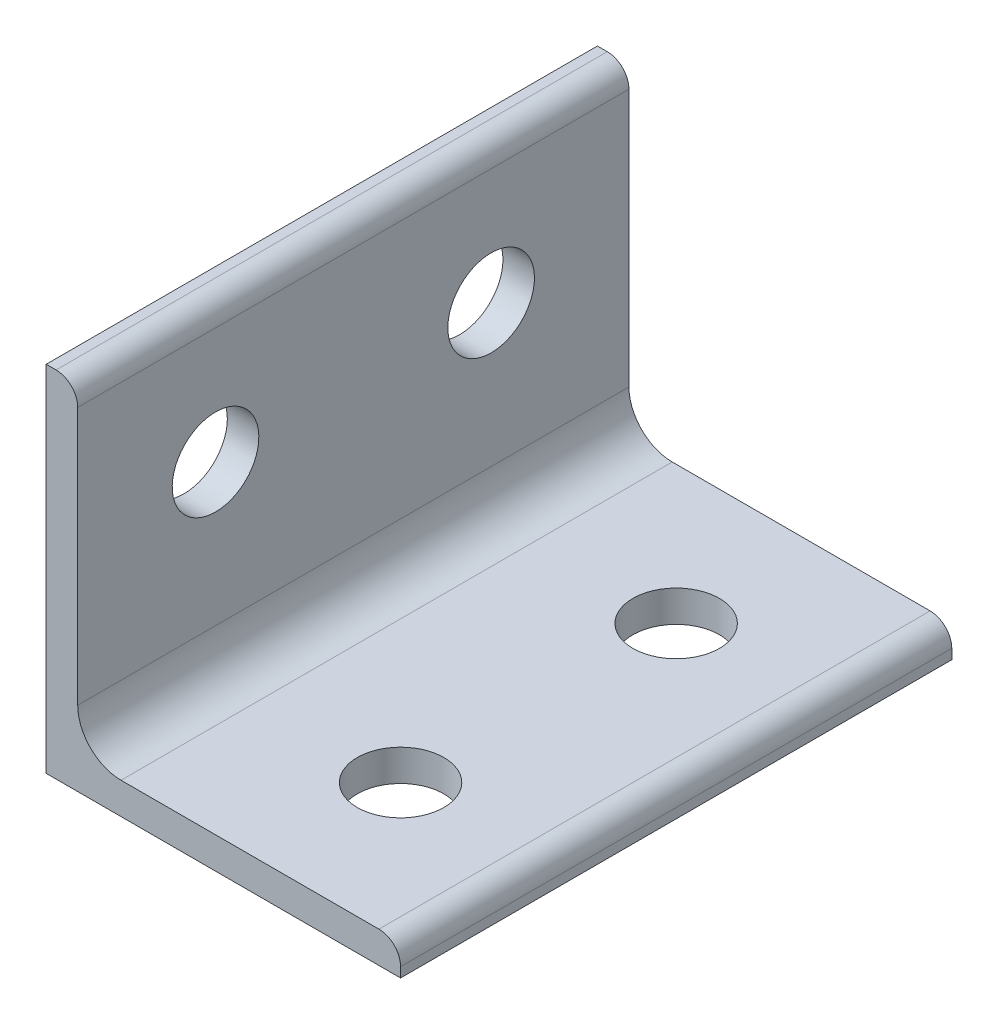
ISO-10303-21;
HEADER;
FILE_DESCRIPTION(('STEP AP214'),'2;1');
FILE_NAME('part.step','',(''),(''),'','','');
FILE_SCHEMA(('AUTOMOTIVE_DESIGN { 1 0 10303 214 1 1 1 1 }'));
ENDSEC;
DATA;
#1=APPLICATION_CONTEXT('core data for automotive mechanical design processes');
#2=APPLICATION_PROTOCOL_DEFINITION('international standard','automotive_design',2000,#1);
#3=PRODUCT_CONTEXT('',#1,'mechanical');
#4=PRODUCT('Part','Part','',(#3));
#5=PRODUCT_RELATED_PRODUCT_CATEGORY('part','',(#4));
#6=PRODUCT_DEFINITION_FORMATION('','',#4);
#7=PRODUCT_DEFINITION_CONTEXT('part definition',#1,'design');
#8=PRODUCT_DEFINITION('design','',#6,#7);
#9=PRODUCT_DEFINITION_SHAPE('','',#8);
#10=(LENGTH_UNIT() NAMED_UNIT(*) SI_UNIT(.MILLI.,.METRE.));
#11=(NAMED_UNIT(*) PLANE_ANGLE_UNIT() SI_UNIT($,.RADIAN.));
#12=(NAMED_UNIT(*) SI_UNIT($,.STERADIAN.) SOLID_ANGLE_UNIT());
#13=UNCERTAINTY_MEASURE_WITH_UNIT(LENGTH_MEASURE(1.E-05),#10,'distance_accuracy_value','');
#14=(GEOMETRIC_REPRESENTATION_CONTEXT(3) GLOBAL_UNCERTAINTY_ASSIGNED_CONTEXT((#13)) GLOBAL_UNIT_ASSIGNED_CONTEXT((#10,
#11,#12)) REPRESENTATION_CONTEXT('',''));
#15=CARTESIAN_POINT('',(0.,0.,0.));
#16=DIRECTION('',(0.,0.,1.));
#17=DIRECTION('',(1.,0.,0.));
#18=AXIS2_PLACEMENT_3D('',#15,#16,#17);
#19=CARTESIAN_POINT('',(0.,0.,70.));
#20=DIRECTION('',(0.,1.,0.));
#21=DIRECTION('',(0.,0.,1.));
#22=AXIS2_PLACEMENT_3D('',#19,#20,#21);
#23=PLANE('',#22);
#24=CARTESIAN_POINT('',(55.,0.,-35.));
#25=DIRECTION('',(0.,1.,0.));
#26=DIRECTION('',(0.,0.,1.));
#27=AXIS2_PLACEMENT_3D('',#24,#25,#26);
#28=CIRCLE('',#27,11.);
#29=CARTESIAN_POINT('',(55.,0.,-24.));
#30=VERTEX_POINT('',#29);
#31=EDGE_CURVE('E182',#30,#30,#28,.T.);
#32=ORIENTED_EDGE('',*,*,#31,.T.);
#33=EDGE_LOOP('',(#32));
#34=FACE_BOUND('',#33,.T.);
#35=CARTESIAN_POINT('',(55.,0.,35.));
#36=DIRECTION('',(0.,1.,0.));
#37=DIRECTION('',(0.,0.,1.));
#38=AXIS2_PLACEMENT_3D('',#35,#36,#37);
#39=CIRCLE('',#38,11.);
#40=CARTESIAN_POINT('',(55.,0.,46.));
#41=VERTEX_POINT('',#40);
#42=EDGE_CURVE('E148',#41,#41,#39,.T.);
#43=ORIENTED_EDGE('',*,*,#42,.T.);
#44=EDGE_LOOP('',(#43));
#45=FACE_BOUND('',#44,.T.);
#46=DIRECTION('',(1.,0.,0.));
#47=VECTOR('',#46,1.);
#48=CARTESIAN_POINT('',(0.,0.,-70.));
#49=LINE('',#48,#47);
#50=CARTESIAN_POINT('',(0.,0.,-70.));
#51=VERTEX_POINT('',#50);
#52=CARTESIAN_POINT('',(90.,0.,-70.));
#53=VERTEX_POINT('',#52);
#54=EDGE_CURVE('E144',#51,#53,#49,.T.);
#55=ORIENTED_EDGE('',*,*,#54,.T.);
#56=DIRECTION('',(0.,0.,-1.));
#57=VECTOR('',#56,1.);
#58=CARTESIAN_POINT('',(90.,0.,70.));
#59=LINE('',#58,#57);
#60=CARTESIAN_POINT('',(90.,0.,70.));
#61=VERTEX_POINT('',#60);
#62=EDGE_CURVE('E11',#61,#53,#59,.T.);
#63=ORIENTED_EDGE('',*,*,#62,.F.);
#64=DIRECTION('',(1.,0.,0.));
#65=VECTOR('',#64,1.);
#66=CARTESIAN_POINT('',(0.,0.,70.));
#67=LINE('',#66,#65);
#68=CARTESIAN_POINT('',(0.,0.,70.));
#69=VERTEX_POINT('',#68);
#70=EDGE_CURVE('E161',#69,#61,#67,.T.);
#71=ORIENTED_EDGE('',*,*,#70,.F.);
#72=DIRECTION('',(0.,0.,-1.));
#73=VECTOR('',#72,1.);
#74=CARTESIAN_POINT('',(0.,0.,70.));
#75=LINE('',#74,#73);
#76=EDGE_CURVE('E140',#69,#51,#75,.T.);
#77=ORIENTED_EDGE('',*,*,#76,.T.);
#78=EDGE_LOOP('',(#55,#63,#71,#77));
#79=FACE_BOUND('',#78,.T.);
#80=ADVANCED_FACE('F40',(#34,#45,#79),#23,.F.);
#81=CARTESIAN_POINT('',(90.,0.,70.));
#82=DIRECTION('',(-1.,0.,0.));
#83=DIRECTION('',(0.,0.,1.));
#84=AXIS2_PLACEMENT_3D('',#81,#82,#83);
#85=PLANE('',#84);
#86=DIRECTION('',(0.,1.,0.));
#87=VECTOR('',#86,1.);
#88=CARTESIAN_POINT('',(90.,0.,-70.));
#89=LINE('',#88,#87);
#90=CARTESIAN_POINT('',(90.,2.5,-70.));
#91=VERTEX_POINT('',#90);
#92=EDGE_CURVE('E147',#53,#91,#89,.T.);
#93=ORIENTED_EDGE('',*,*,#92,.T.);
#94=DIRECTION('',(0.,0.,-1.));
#95=VECTOR('',#94,1.);
#96=CARTESIAN_POINT('',(90.,2.5,70.));
#97=LINE('',#96,#95);
#98=CARTESIAN_POINT('',(90.,2.5,70.));
#99=VERTEX_POINT('',#98);
#100=EDGE_CURVE('E49',#99,#91,#97,.T.);
#101=ORIENTED_EDGE('',*,*,#100,.F.);
#102=DIRECTION('',(0.,1.,0.));
#103=VECTOR('',#102,1.);
#104=CARTESIAN_POINT('',(90.,0.,70.));
#105=LINE('',#104,#103);
#106=EDGE_CURVE('E104',#61,#99,#105,.T.);
#107=ORIENTED_EDGE('',*,*,#106,.F.);
#108=ORIENTED_EDGE('',*,*,#62,.T.);
#109=EDGE_LOOP('',(#93,#101,#107,#108));
#110=FACE_BOUND('',#109,.T.);
#111=ADVANCED_FACE('F238',(#110),#85,.F.);
#112=CARTESIAN_POINT('',(84.5,2.5,70.));
#113=DIRECTION('',(0.,0.,-1.));
#114=DIRECTION('',(-1.,0.,0.));
#115=AXIS2_PLACEMENT_3D('',#112,#113,#114);
#116=CYLINDRICAL_SURFACE('',#115,5.50000000000001);
#117=CARTESIAN_POINT('',(84.5,2.5,-70.));
#118=DIRECTION('',(0.,0.,1.));
#119=DIRECTION('',(1.,0.,0.));
#120=AXIS2_PLACEMENT_3D('',#117,#118,#119);
#121=CIRCLE('',#120,5.50000000000001);
#122=CARTESIAN_POINT('',(84.5,8.,-70.));
#123=VERTEX_POINT('',#122);
#124=EDGE_CURVE('E150',#91,#123,#121,.T.);
#125=ORIENTED_EDGE('',*,*,#124,.T.);
#126=DIRECTION('',(0.,0.,-1.));
#127=VECTOR('',#126,1.);
#128=CARTESIAN_POINT('',(84.5,8.,70.));
#129=LINE('',#128,#127);
#130=CARTESIAN_POINT('',(84.5,8.,70.));
#131=VERTEX_POINT('',#130);
#132=EDGE_CURVE('E171',#131,#123,#129,.T.);
#133=ORIENTED_EDGE('',*,*,#132,.F.);
#134=CARTESIAN_POINT('',(84.5,2.5,70.));
#135=DIRECTION('',(0.,0.,1.));
#136=DIRECTION('',(1.,0.,0.));
#137=AXIS2_PLACEMENT_3D('',#134,#135,#136);
#138=CIRCLE('',#137,5.50000000000001);
#139=EDGE_CURVE('E202',#99,#131,#138,.T.);
#140=ORIENTED_EDGE('',*,*,#139,.F.);
#141=ORIENTED_EDGE('',*,*,#100,.T.);
#142=EDGE_LOOP('',(#125,#133,#140,#141));
#143=FACE_BOUND('',#142,.T.);
#144=ADVANCED_FACE('F245',(#143),#116,.T.);
#145=CARTESIAN_POINT('',(84.5,8.,70.));
#146=DIRECTION('',(0.,-1.,0.));
#147=DIRECTION('',(1.,0.,0.));
#148=AXIS2_PLACEMENT_3D('',#145,#146,#147);
#149=PLANE('',#148);
#150=CARTESIAN_POINT('',(55.,8.,-35.));
#151=DIRECTION('',(0.,1.,0.));
#152=DIRECTION('',(0.,0.,1.));
#153=AXIS2_PLACEMENT_3D('',#150,#151,#152);
#154=CIRCLE('',#153,11.);
#155=CARTESIAN_POINT('',(55.,8.,-24.));
#156=VERTEX_POINT('',#155);
#157=EDGE_CURVE('E192',#156,#156,#154,.T.);
#158=ORIENTED_EDGE('',*,*,#157,.F.);
#159=EDGE_LOOP('',(#158));
#160=FACE_BOUND('',#159,.T.);
#161=CARTESIAN_POINT('',(55.,8.,35.));
#162=DIRECTION('',(0.,1.,0.));
#163=DIRECTION('',(0.,0.,1.));
#164=AXIS2_PLACEMENT_3D('',#161,#162,#163);
#165=CIRCLE('',#164,11.);
#166=CARTESIAN_POINT('',(55.,8.,46.));
#167=VERTEX_POINT('',#166);
#168=EDGE_CURVE('E195',#167,#167,#165,.T.);
#169=ORIENTED_EDGE('',*,*,#168,.F.);
#170=EDGE_LOOP('',(#169));
#171=FACE_BOUND('',#170,.T.);
#172=DIRECTION('',(-1.,0.,0.));
#173=VECTOR('',#172,1.);
#174=CARTESIAN_POINT('',(84.5,8.,-70.));
#175=LINE('',#174,#173);
#176=CARTESIAN_POINT('',(19.,8.,-70.));
#177=VERTEX_POINT('',#176);
#178=EDGE_CURVE('E152',#123,#177,#175,.T.);
#179=ORIENTED_EDGE('',*,*,#178,.T.);
#180=DIRECTION('',(0.,0.,-1.));
#181=VECTOR('',#180,1.);
#182=CARTESIAN_POINT('',(19.,8.,70.));
#183=LINE('',#182,#181);
#184=CARTESIAN_POINT('',(19.,8.,70.));
#185=VERTEX_POINT('',#184);
#186=EDGE_CURVE('E168',#185,#177,#183,.T.);
#187=ORIENTED_EDGE('',*,*,#186,.F.);
#188=DIRECTION('',(-1.,0.,0.));
#189=VECTOR('',#188,1.);
#190=CARTESIAN_POINT('',(84.5,8.,70.));
#191=LINE('',#190,#189);
#192=EDGE_CURVE('E204',#131,#185,#191,.T.);
#193=ORIENTED_EDGE('',*,*,#192,.F.);
#194=ORIENTED_EDGE('',*,*,#132,.T.);
#195=EDGE_LOOP('',(#179,#187,#193,#194));
#196=FACE_BOUND('',#195,.T.);
#197=ADVANCED_FACE('F256',(#160,#171,#196),#149,.F.);
#198=CARTESIAN_POINT('',(19.,19.,70.));
#199=DIRECTION('',(0.,0.,-1.));
#200=DIRECTION('',(-1.,0.,0.));
#201=AXIS2_PLACEMENT_3D('',#198,#199,#200);
#202=CYLINDRICAL_SURFACE('',#201,11.);
#203=CARTESIAN_POINT('',(19.,19.,-70.));
#204=DIRECTION('',(0.,0.,-1.));
#205=DIRECTION('',(-1.,0.,0.));
#206=AXIS2_PLACEMENT_3D('',#203,#204,#205);
#207=CIRCLE('',#206,11.);
#208=CARTESIAN_POINT('',(8.00000000000001,19.,-70.));
#209=VERTEX_POINT('',#208);
#210=EDGE_CURVE('E154',#177,#209,#207,.T.);
#211=ORIENTED_EDGE('',*,*,#210,.T.);
#212=DIRECTION('',(0.,0.,-1.));
#213=VECTOR('',#212,1.);
#214=CARTESIAN_POINT('',(8.00000000000001,19.,70.));
#215=LINE('',#214,#213);
#216=CARTESIAN_POINT('',(8.00000000000001,19.,70.));
#217=VERTEX_POINT('',#216);
#218=EDGE_CURVE('E165',#217,#209,#215,.T.);
#219=ORIENTED_EDGE('',*,*,#218,.F.);
#220=CARTESIAN_POINT('',(19.,19.,70.));
#221=DIRECTION('',(0.,0.,-1.));
#222=DIRECTION('',(-1.,0.,0.));
#223=AXIS2_PLACEMENT_3D('',#220,#221,#222);
#224=CIRCLE('',#223,11.);
#225=EDGE_CURVE('E206',#185,#217,#224,.T.);
#226=ORIENTED_EDGE('',*,*,#225,.F.);
#227=ORIENTED_EDGE('',*,*,#186,.T.);
#228=EDGE_LOOP('',(#211,#219,#226,#227));
#229=FACE_BOUND('',#228,.T.);
#230=ADVANCED_FACE('F212',(#229),#202,.F.);
#231=CARTESIAN_POINT('',(8.00000000000001,19.,70.));
#232=DIRECTION('',(-1.,0.,0.));
#233=DIRECTION('',(0.,-1.,0.));
#234=AXIS2_PLACEMENT_3D('',#231,#232,#233);
#235=PLANE('',#234);
#236=CARTESIAN_POINT('',(8.00000000000001,55.,-35.));
#237=DIRECTION('',(-1.,0.,0.));
#238=DIRECTION('',(0.,-1.,0.));
#239=AXIS2_PLACEMENT_3D('',#236,#237,#238);
#240=CIRCLE('',#239,11.);
#241=CARTESIAN_POINT('',(8.00000000000001,44.,-35.));
#242=VERTEX_POINT('',#241);
#243=EDGE_CURVE('E43',#242,#242,#240,.T.);
#244=ORIENTED_EDGE('',*,*,#243,.T.);
#245=EDGE_LOOP('',(#244));
#246=FACE_BOUND('',#245,.T.);
#247=CARTESIAN_POINT('',(8.00000000000001,55.,35.));
#248=DIRECTION('',(-1.,0.,0.));
#249=DIRECTION('',(0.,-1.,0.));
#250=AXIS2_PLACEMENT_3D('',#247,#248,#249);
#251=CIRCLE('',#250,11.);
#252=CARTESIAN_POINT('',(8.00000000000001,44.,35.));
#253=VERTEX_POINT('',#252);
#254=EDGE_CURVE('E175',#253,#253,#251,.T.);
#255=ORIENTED_EDGE('',*,*,#254,.T.);
#256=EDGE_LOOP('',(#255));
#257=FACE_BOUND('',#256,.T.);
#258=DIRECTION('',(0.,1.,0.));
#259=VECTOR('',#258,1.);
#260=CARTESIAN_POINT('',(8.00000000000001,19.,-70.));
#261=LINE('',#260,#259);
#262=CARTESIAN_POINT('',(8.00000000000001,84.5,-70.));
#263=VERTEX_POINT('',#262);
#264=EDGE_CURVE('E156',#209,#263,#261,.T.);
#265=ORIENTED_EDGE('',*,*,#264,.T.);
#266=DIRECTION('',(0.,0.,-1.));
#267=VECTOR('',#266,1.);
#268=CARTESIAN_POINT('',(8.00000000000001,84.5,70.));
#269=LINE('',#268,#267);
#270=CARTESIAN_POINT('',(8.00000000000001,84.5,70.));
#271=VERTEX_POINT('',#270);
#272=EDGE_CURVE('E135',#271,#263,#269,.T.);
#273=ORIENTED_EDGE('',*,*,#272,.F.);
#274=DIRECTION('',(0.,1.,0.));
#275=VECTOR('',#274,1.);
#276=CARTESIAN_POINT('',(8.00000000000001,19.,70.));
#277=LINE('',#276,#275);
#278=EDGE_CURVE('E126',#217,#271,#277,.T.);
#279=ORIENTED_EDGE('',*,*,#278,.F.);
#280=ORIENTED_EDGE('',*,*,#218,.T.);
#281=EDGE_LOOP('',(#265,#273,#279,#280));
#282=FACE_BOUND('',#281,.T.);
#283=ADVANCED_FACE('F216',(#246,#257,#282),#235,.F.);
#284=CARTESIAN_POINT('',(2.50000000000001,84.5,70.));
#285=DIRECTION('',(0.,0.,-1.));
#286=DIRECTION('',(-1.,0.,0.));
#287=AXIS2_PLACEMENT_3D('',#284,#285,#286);
#288=CYLINDRICAL_SURFACE('',#287,5.5);
#289=CARTESIAN_POINT('',(2.50000000000001,84.5,-70.));
#290=DIRECTION('',(0.,0.,1.));
#291=DIRECTION('',(1.,0.,0.));
#292=AXIS2_PLACEMENT_3D('',#289,#290,#291);
#293=CIRCLE('',#292,5.5);
#294=CARTESIAN_POINT('',(2.50000000000001,90.,-70.));
#295=VERTEX_POINT('',#294);
#296=EDGE_CURVE('E134',#263,#295,#293,.T.);
#297=ORIENTED_EDGE('',*,*,#296,.T.);
#298=DIRECTION('',(0.,0.,-1.));
#299=VECTOR('',#298,1.);
#300=CARTESIAN_POINT('',(2.50000000000001,90.,70.));
#301=LINE('',#300,#299);
#302=CARTESIAN_POINT('',(2.50000000000001,90.,70.));
#303=VERTEX_POINT('',#302);
#304=EDGE_CURVE('E131',#303,#295,#301,.T.);
#305=ORIENTED_EDGE('',*,*,#304,.F.);
#306=CARTESIAN_POINT('',(2.50000000000001,84.5,70.));
#307=DIRECTION('',(0.,0.,1.));
#308=DIRECTION('',(1.,0.,0.));
#309=AXIS2_PLACEMENT_3D('',#306,#307,#308);
#310=CIRCLE('',#309,5.5);
#311=EDGE_CURVE('E120',#271,#303,#310,.T.);
#312=ORIENTED_EDGE('',*,*,#311,.F.);
#313=ORIENTED_EDGE('',*,*,#272,.T.);
#314=EDGE_LOOP('',(#297,#305,#312,#313));
#315=FACE_BOUND('',#314,.T.);
#316=ADVANCED_FACE('F132',(#315),#288,.T.);
#317=CARTESIAN_POINT('',(2.50000000000001,90.,70.));
#318=DIRECTION('',(0.,-1.,0.));
#319=DIRECTION('',(0.,0.,-1.));
#320=AXIS2_PLACEMENT_3D('',#317,#318,#319);
#321=PLANE('',#320);
#322=DIRECTION('',(-1.,0.,0.));
#323=VECTOR('',#322,1.);
#324=CARTESIAN_POINT('',(2.50000000000001,90.,-70.));
#325=LINE('',#324,#323);
#326=CARTESIAN_POINT('',(0.,90.,-70.));
#327=VERTEX_POINT('',#326);
#328=EDGE_CURVE('E90',#295,#327,#325,.T.);
#329=ORIENTED_EDGE('',*,*,#328,.T.);
#330=DIRECTION('',(0.,0.,-1.));
#331=VECTOR('',#330,1.);
#332=CARTESIAN_POINT('',(0.,90.,70.));
#333=LINE('',#332,#331);
#334=CARTESIAN_POINT('',(0.,90.,70.));
#335=VERTEX_POINT('',#334);
#336=EDGE_CURVE('E136',#335,#327,#333,.T.);
#337=ORIENTED_EDGE('',*,*,#336,.F.);
#338=DIRECTION('',(-1.,0.,0.));
#339=VECTOR('',#338,1.);
#340=CARTESIAN_POINT('',(2.50000000000001,90.,70.));
#341=LINE('',#340,#339);
#342=EDGE_CURVE('E124',#303,#335,#341,.T.);
#343=ORIENTED_EDGE('',*,*,#342,.F.);
#344=ORIENTED_EDGE('',*,*,#304,.T.);
#345=EDGE_LOOP('',(#329,#337,#343,#344));
#346=FACE_BOUND('',#345,.T.);
#347=ADVANCED_FACE('F138',(#346),#321,.F.);
#348=CARTESIAN_POINT('',(0.,90.,70.));
#349=DIRECTION('',(1.,0.,0.));
#350=DIRECTION('',(0.,1.,0.));
#351=AXIS2_PLACEMENT_3D('',#348,#349,#350);
#352=PLANE('',#351);
#353=CARTESIAN_POINT('',(0.,55.,-35.));
#354=DIRECTION('',(1.,0.,0.));
#355=DIRECTION('',(0.,1.,0.));
#356=AXIS2_PLACEMENT_3D('',#353,#354,#355);
#357=CIRCLE('',#356,11.);
#358=CARTESIAN_POINT('',(0.,66.,-35.));
#359=VERTEX_POINT('',#358);
#360=EDGE_CURVE('E178',#359,#359,#357,.T.);
#361=ORIENTED_EDGE('',*,*,#360,.T.);
#362=EDGE_LOOP('',(#361));
#363=FACE_BOUND('',#362,.T.);
#364=CARTESIAN_POINT('',(0.,55.,35.));
#365=DIRECTION('',(1.,0.,0.));
#366=DIRECTION('',(0.,1.,0.));
#367=AXIS2_PLACEMENT_3D('',#364,#365,#366);
#368=CIRCLE('',#367,11.);
#369=CARTESIAN_POINT('',(0.,66.,35.));
#370=VERTEX_POINT('',#369);
#371=EDGE_CURVE('E177',#370,#370,#368,.T.);
#372=ORIENTED_EDGE('',*,*,#371,.T.);
#373=EDGE_LOOP('',(#372));
#374=FACE_BOUND('',#373,.T.);
#375=DIRECTION('',(0.,-1.,0.));
#376=VECTOR('',#375,1.);
#377=CARTESIAN_POINT('',(0.,90.,-70.));
#378=LINE('',#377,#376);
#379=EDGE_CURVE('E96',#327,#51,#378,.T.);
#380=ORIENTED_EDGE('',*,*,#379,.T.);
#381=ORIENTED_EDGE('',*,*,#76,.F.);
#382=DIRECTION('',(0.,-1.,0.));
#383=VECTOR('',#382,1.);
#384=CARTESIAN_POINT('',(0.,90.,70.));
#385=LINE('',#384,#383);
#386=EDGE_CURVE('E58',#335,#69,#385,.T.);
#387=ORIENTED_EDGE('',*,*,#386,.F.);
#388=ORIENTED_EDGE('',*,*,#336,.T.);
#389=EDGE_LOOP('',(#380,#381,#387,#388));
#390=FACE_BOUND('',#389,.T.);
#391=ADVANCED_FACE('F224',(#363,#374,#390),#352,.F.);
#392=CARTESIAN_POINT('',(84.5,2.5,70.));
#393=DIRECTION('',(0.,0.,1.));
#394=DIRECTION('',(1.,0.,0.));
#395=AXIS2_PLACEMENT_3D('',#392,#393,#394);
#396=PLANE('',#395);
#397=ORIENTED_EDGE('',*,*,#70,.T.);
#398=ORIENTED_EDGE('',*,*,#106,.T.);
#399=ORIENTED_EDGE('',*,*,#139,.T.);
#400=ORIENTED_EDGE('',*,*,#192,.T.);
#401=ORIENTED_EDGE('',*,*,#225,.T.);
#402=ORIENTED_EDGE('',*,*,#278,.T.);
#403=ORIENTED_EDGE('',*,*,#311,.T.);
#404=ORIENTED_EDGE('',*,*,#342,.T.);
#405=ORIENTED_EDGE('',*,*,#386,.T.);
#406=EDGE_LOOP('',(#397,#398,#399,#400,#401,#402,#403,#404,#405));
#407=FACE_BOUND('',#406,.T.);
#408=ADVANCED_FACE('F122',(#407),#396,.T.);
#409=CARTESIAN_POINT('',(84.5,2.5,-70.));
#410=DIRECTION('',(0.,0.,1.));
#411=DIRECTION('',(1.,0.,0.));
#412=AXIS2_PLACEMENT_3D('',#409,#410,#411);
#413=PLANE('',#412);
#414=ORIENTED_EDGE('',*,*,#54,.F.);
#415=ORIENTED_EDGE('',*,*,#379,.F.);
#416=ORIENTED_EDGE('',*,*,#328,.F.);
#417=ORIENTED_EDGE('',*,*,#296,.F.);
#418=ORIENTED_EDGE('',*,*,#264,.F.);
#419=ORIENTED_EDGE('',*,*,#210,.F.);
#420=ORIENTED_EDGE('',*,*,#178,.F.);
#421=ORIENTED_EDGE('',*,*,#124,.F.);
#422=ORIENTED_EDGE('',*,*,#92,.F.);
#423=EDGE_LOOP('',(#414,#415,#416,#417,#418,#419,#420,#421,#422));
#424=FACE_BOUND('',#423,.T.);
#425=ADVANCED_FACE('F219',(#424),#413,.F.);
#426=CARTESIAN_POINT('',(55.,8.,35.));
#427=DIRECTION('',(0.,1.,0.));
#428=DIRECTION('',(0.,0.,1.));
#429=AXIS2_PLACEMENT_3D('',#426,#427,#428);
#430=CYLINDRICAL_SURFACE('',#429,11.);
#431=ORIENTED_EDGE('',*,*,#42,.F.);
#432=EDGE_LOOP('',(#431));
#433=FACE_BOUND('',#432,.T.);
#434=ORIENTED_EDGE('',*,*,#168,.T.);
#435=EDGE_LOOP('',(#434));
#436=FACE_BOUND('',#435,.T.);
#437=ADVANCED_FACE('F250',(#433,#436),#430,.F.);
#438=CARTESIAN_POINT('',(55.,8.,-35.));
#439=DIRECTION('',(0.,1.,0.));
#440=DIRECTION('',(0.,0.,1.));
#441=AXIS2_PLACEMENT_3D('',#438,#439,#440);
#442=CYLINDRICAL_SURFACE('',#441,11.);
#443=ORIENTED_EDGE('',*,*,#31,.F.);
#444=EDGE_LOOP('',(#443));
#445=FACE_BOUND('',#444,.T.);
#446=ORIENTED_EDGE('',*,*,#157,.T.);
#447=EDGE_LOOP('',(#446));
#448=FACE_BOUND('',#447,.T.);
#449=ADVANCED_FACE('F252',(#445,#448),#442,.F.);
#450=CARTESIAN_POINT('',(-8.00000000000019,55.,35.));
#451=DIRECTION('',(-1.,0.,0.));
#452=DIRECTION('',(0.,0.,1.));
#453=AXIS2_PLACEMENT_3D('',#450,#451,#452);
#454=CYLINDRICAL_SURFACE('',#453,11.);
#455=ORIENTED_EDGE('',*,*,#254,.F.);
#456=EDGE_LOOP('',(#455));
#457=FACE_BOUND('',#456,.T.);
#458=ORIENTED_EDGE('',*,*,#371,.F.);
#459=EDGE_LOOP('',(#458));
#460=FACE_BOUND('',#459,.T.);
#461=ADVANCED_FACE('F310',(#457,#460),#454,.F.);
#462=CARTESIAN_POINT('',(-8.00000000000019,55.,-35.));
#463=DIRECTION('',(-1.,0.,0.));
#464=DIRECTION('',(0.,0.,1.));
#465=AXIS2_PLACEMENT_3D('',#462,#463,#464);
#466=CYLINDRICAL_SURFACE('',#465,11.);
#467=ORIENTED_EDGE('',*,*,#243,.F.);
#468=EDGE_LOOP('',(#467));
#469=FACE_BOUND('',#468,.T.);
#470=ORIENTED_EDGE('',*,*,#360,.F.);
#471=EDGE_LOOP('',(#470));
#472=FACE_BOUND('',#471,.T.);
#473=ADVANCED_FACE('F319',(#469,#472),#466,.F.);
#474=CLOSED_SHELL('',(#80,#111,#144,#197,#230,#283,#316,#347,#391,#408,#425,#437,#449,#461,#473));
#475=MANIFOLD_SOLID_BREP('B2',#474);
#476=ADVANCED_BREP_SHAPE_REPRESENTATION('',(#18,#475),#14);
#477=SHAPE_DEFINITION_REPRESENTATION(#9,#476);
ENDSEC;
END-ISO-10303-21;
